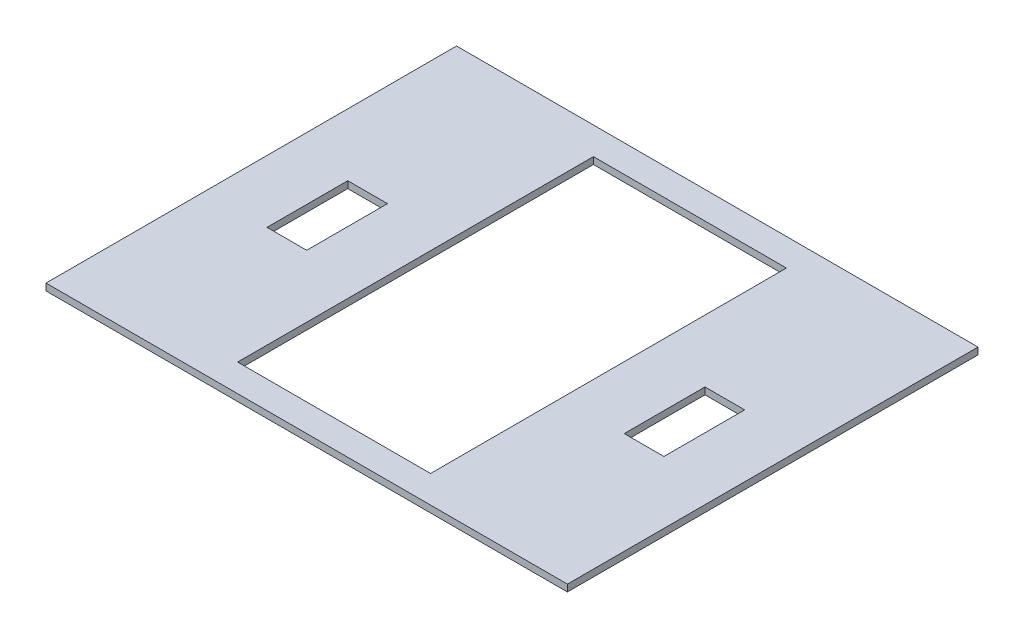
ISO-10303-21;
HEADER;
FILE_DESCRIPTION(('STEP AP214'),'2;1');
FILE_NAME('part.step','',(''),(''),'','','');
FILE_SCHEMA(('AUTOMOTIVE_DESIGN { 1 0 10303 214 1 1 1 1 }'));
ENDSEC;
DATA;
#1=APPLICATION_CONTEXT('core data for automotive mechanical design processes');
#2=APPLICATION_PROTOCOL_DEFINITION('international standard','automotive_design',2000,#1);
#3=PRODUCT_CONTEXT('',#1,'mechanical');
#4=PRODUCT('Part','Part','',(#3));
#5=PRODUCT_RELATED_PRODUCT_CATEGORY('part','',(#4));
#6=PRODUCT_DEFINITION_FORMATION('','',#4);
#7=PRODUCT_DEFINITION_CONTEXT('part definition',#1,'design');
#8=PRODUCT_DEFINITION('design','',#6,#7);
#9=PRODUCT_DEFINITION_SHAPE('','',#8);
#10=(LENGTH_UNIT() NAMED_UNIT(*) SI_UNIT(.MILLI.,.METRE.));
#11=(NAMED_UNIT(*) PLANE_ANGLE_UNIT() SI_UNIT($,.RADIAN.));
#12=(NAMED_UNIT(*) SI_UNIT($,.STERADIAN.) SOLID_ANGLE_UNIT());
#13=UNCERTAINTY_MEASURE_WITH_UNIT(LENGTH_MEASURE(1.E-05),#10,'distance_accuracy_value','');
#14=(GEOMETRIC_REPRESENTATION_CONTEXT(3) GLOBAL_UNCERTAINTY_ASSIGNED_CONTEXT((#13)) GLOBAL_UNIT_ASSIGNED_CONTEXT((#10,
#11,#12)) REPRESENTATION_CONTEXT('',''));
#15=CARTESIAN_POINT('',(0.,0.,0.));
#16=DIRECTION('',(0.,0.,1.));
#17=DIRECTION('',(1.,0.,0.));
#18=AXIS2_PLACEMENT_3D('',#15,#16,#17);
#19=CARTESIAN_POINT('',(0.,5.,0.));
#20=DIRECTION('',(1.,0.,0.));
#21=DIRECTION('',(0.,0.,-1.));
#22=AXIS2_PLACEMENT_3D('',#19,#20,#21);
#23=PLANE('',#22);
#24=DIRECTION('',(0.,0.,1.));
#25=VECTOR('',#24,1.);
#26=CARTESIAN_POINT('',(0.,0.,0.));
#27=LINE('',#26,#25);
#28=CARTESIAN_POINT('',(0.,0.,-300.));
#29=VERTEX_POINT('',#28);
#30=CARTESIAN_POINT('',(0.,0.,0.));
#31=VERTEX_POINT('',#30);
#32=EDGE_CURVE('E199',#29,#31,#27,.T.);
#33=ORIENTED_EDGE('',*,*,#32,.T.);
#34=DIRECTION('',(0.,-1.,0.));
#35=VECTOR('',#34,1.);
#36=CARTESIAN_POINT('',(0.,5.,0.));
#37=LINE('',#36,#35);
#38=CARTESIAN_POINT('',(0.,5.,0.));
#39=VERTEX_POINT('',#38);
#40=EDGE_CURVE('E11',#39,#31,#37,.T.);
#41=ORIENTED_EDGE('',*,*,#40,.F.);
#42=DIRECTION('',(0.,0.,1.));
#43=VECTOR('',#42,1.);
#44=CARTESIAN_POINT('',(0.,5.,0.));
#45=LINE('',#44,#43);
#46=CARTESIAN_POINT('',(0.,5.,-300.));
#47=VERTEX_POINT('',#46);
#48=EDGE_CURVE('E290',#47,#39,#45,.T.);
#49=ORIENTED_EDGE('',*,*,#48,.F.);
#50=DIRECTION('',(0.,-1.,0.));
#51=VECTOR('',#50,1.);
#52=CARTESIAN_POINT('',(0.,5.,-300.));
#53=LINE('',#52,#51);
#54=EDGE_CURVE('E304',#47,#29,#53,.T.);
#55=ORIENTED_EDGE('',*,*,#54,.T.);
#56=EDGE_LOOP('',(#33,#41,#49,#55));
#57=FACE_BOUND('',#56,.T.);
#58=ADVANCED_FACE('F39',(#57),#23,.F.);
#59=CARTESIAN_POINT('',(0.,5.,0.));
#60=DIRECTION('',(0.,0.,-1.));
#61=DIRECTION('',(-1.,0.,0.));
#62=AXIS2_PLACEMENT_3D('',#59,#60,#61);
#63=PLANE('',#62);
#64=DIRECTION('',(1.,0.,0.));
#65=VECTOR('',#64,1.);
#66=CARTESIAN_POINT('',(0.,0.,0.));
#67=LINE('',#66,#65);
#68=CARTESIAN_POINT('',(381.,0.,0.));
#69=VERTEX_POINT('',#68);
#70=EDGE_CURVE('E308',#31,#69,#67,.T.);
#71=ORIENTED_EDGE('',*,*,#70,.T.);
#72=DIRECTION('',(0.,-1.,0.));
#73=VECTOR('',#72,1.);
#74=CARTESIAN_POINT('',(381.,5.,0.));
#75=LINE('',#74,#73);
#76=CARTESIAN_POINT('',(381.,5.,0.));
#77=VERTEX_POINT('',#76);
#78=EDGE_CURVE('E47',#77,#69,#75,.T.);
#79=ORIENTED_EDGE('',*,*,#78,.F.);
#80=DIRECTION('',(1.,0.,0.));
#81=VECTOR('',#80,1.);
#82=CARTESIAN_POINT('',(0.,5.,0.));
#83=LINE('',#82,#81);
#84=EDGE_CURVE('E294',#39,#77,#83,.T.);
#85=ORIENTED_EDGE('',*,*,#84,.F.);
#86=ORIENTED_EDGE('',*,*,#40,.T.);
#87=EDGE_LOOP('',(#71,#79,#85,#86));
#88=FACE_BOUND('',#87,.T.);
#89=ADVANCED_FACE('F343',(#88),#63,.F.);
#90=CARTESIAN_POINT('',(381.,5.,0.));
#91=DIRECTION('',(-1.,0.,0.));
#92=DIRECTION('',(0.,0.,1.));
#93=AXIS2_PLACEMENT_3D('',#90,#91,#92);
#94=PLANE('',#93);
#95=DIRECTION('',(0.,0.,-1.));
#96=VECTOR('',#95,1.);
#97=CARTESIAN_POINT('',(381.,0.,0.));
#98=LINE('',#97,#96);
#99=CARTESIAN_POINT('',(381.,0.,-300.));
#100=VERTEX_POINT('',#99);
#101=EDGE_CURVE('E311',#69,#100,#98,.T.);
#102=ORIENTED_EDGE('',*,*,#101,.T.);
#103=DIRECTION('',(0.,-1.,0.));
#104=VECTOR('',#103,1.);
#105=CARTESIAN_POINT('',(381.,5.,-300.));
#106=LINE('',#105,#104);
#107=CARTESIAN_POINT('',(381.,5.,-300.));
#108=VERTEX_POINT('',#107);
#109=EDGE_CURVE('E319',#108,#100,#106,.T.);
#110=ORIENTED_EDGE('',*,*,#109,.F.);
#111=DIRECTION('',(0.,0.,-1.));
#112=VECTOR('',#111,1.);
#113=CARTESIAN_POINT('',(381.,5.,0.));
#114=LINE('',#113,#112);
#115=EDGE_CURVE('E298',#77,#108,#114,.T.);
#116=ORIENTED_EDGE('',*,*,#115,.F.);
#117=ORIENTED_EDGE('',*,*,#78,.T.);
#118=EDGE_LOOP('',(#102,#110,#116,#117));
#119=FACE_BOUND('',#118,.T.);
#120=ADVANCED_FACE('F328',(#119),#94,.F.);
#121=CARTESIAN_POINT('',(0.,5.,-300.));
#122=DIRECTION('',(0.,0.,1.));
#123=DIRECTION('',(1.,0.,0.));
#124=AXIS2_PLACEMENT_3D('',#121,#122,#123);
#125=PLANE('',#124);
#126=DIRECTION('',(-1.,0.,0.));
#127=VECTOR('',#126,1.);
#128=CARTESIAN_POINT('',(0.,0.,-300.));
#129=LINE('',#128,#127);
#130=EDGE_CURVE('E295',#100,#29,#129,.T.);
#131=ORIENTED_EDGE('',*,*,#130,.T.);
#132=ORIENTED_EDGE('',*,*,#54,.F.);
#133=DIRECTION('',(-1.,0.,0.));
#134=VECTOR('',#133,1.);
#135=CARTESIAN_POINT('',(0.,5.,-300.));
#136=LINE('',#135,#134);
#137=EDGE_CURVE('E301',#108,#47,#136,.T.);
#138=ORIENTED_EDGE('',*,*,#137,.F.);
#139=ORIENTED_EDGE('',*,*,#109,.T.);
#140=EDGE_LOOP('',(#131,#132,#138,#139));
#141=FACE_BOUND('',#140,.T.);
#142=ADVANCED_FACE('F336',(#141),#125,.F.);
#143=CARTESIAN_POINT('',(0.,5.,0.));
#144=DIRECTION('',(0.,-1.,0.));
#145=DIRECTION('',(0.,0.,-1.));
#146=AXIS2_PLACEMENT_3D('',#143,#144,#145);
#147=PLANE('',#146);
#148=DIRECTION('',(1.,0.,0.));
#149=VECTOR('',#148,1.);
#150=CARTESIAN_POINT('',(45.5,5.,-116.));
#151=LINE('',#150,#149);
#152=CARTESIAN_POINT('',(45.5,5.,-116.));
#153=VERTEX_POINT('',#152);
#154=CARTESIAN_POINT('',(74.5,5.,-116.));
#155=VERTEX_POINT('',#154);
#156=EDGE_CURVE('E189',#153,#155,#151,.T.);
#157=ORIENTED_EDGE('',*,*,#156,.F.);
#158=DIRECTION('',(0.,0.,1.));
#159=VECTOR('',#158,1.);
#160=CARTESIAN_POINT('',(45.5,5.,-175.));
#161=LINE('',#160,#159);
#162=CARTESIAN_POINT('',(45.5,5.,-175.));
#163=VERTEX_POINT('',#162);
#164=EDGE_CURVE('E54',#163,#153,#161,.T.);
#165=ORIENTED_EDGE('',*,*,#164,.F.);
#166=DIRECTION('',(-1.,0.,0.));
#167=VECTOR('',#166,1.);
#168=CARTESIAN_POINT('',(45.5,5.,-175.));
#169=LINE('',#168,#167);
#170=CARTESIAN_POINT('',(74.5,5.,-175.));
#171=VERTEX_POINT('',#170);
#172=EDGE_CURVE('E176',#171,#163,#169,.T.);
#173=ORIENTED_EDGE('',*,*,#172,.F.);
#174=DIRECTION('',(0.,0.,-1.));
#175=VECTOR('',#174,1.);
#176=CARTESIAN_POINT('',(74.5,5.,-175.));
#177=LINE('',#176,#175);
#178=EDGE_CURVE('E180',#155,#171,#177,.T.);
#179=ORIENTED_EDGE('',*,*,#178,.F.);
#180=EDGE_LOOP('',(#157,#165,#173,#179));
#181=FACE_BOUND('',#180,.T.);
#182=DIRECTION('',(1.,0.,0.));
#183=VECTOR('',#182,1.);
#184=CARTESIAN_POINT('',(306.5,5.,-116.));
#185=LINE('',#184,#183);
#186=CARTESIAN_POINT('',(306.5,5.,-116.));
#187=VERTEX_POINT('',#186);
#188=CARTESIAN_POINT('',(335.5,5.,-116.));
#189=VERTEX_POINT('',#188);
#190=EDGE_CURVE('E225',#187,#189,#185,.T.);
#191=ORIENTED_EDGE('',*,*,#190,.F.);
#192=DIRECTION('',(0.,0.,1.));
#193=VECTOR('',#192,1.);
#194=CARTESIAN_POINT('',(306.5,5.,-175.));
#195=LINE('',#194,#193);
#196=CARTESIAN_POINT('',(306.5,5.,-175.));
#197=VERTEX_POINT('',#196);
#198=EDGE_CURVE('E62',#197,#187,#195,.T.);
#199=ORIENTED_EDGE('',*,*,#198,.F.);
#200=DIRECTION('',(-1.,0.,0.));
#201=VECTOR('',#200,1.);
#202=CARTESIAN_POINT('',(306.5,5.,-175.));
#203=LINE('',#202,#201);
#204=CARTESIAN_POINT('',(335.5,5.,-175.));
#205=VERTEX_POINT('',#204);
#206=EDGE_CURVE('E210',#205,#197,#203,.T.);
#207=ORIENTED_EDGE('',*,*,#206,.F.);
#208=DIRECTION('',(0.,0.,-1.));
#209=VECTOR('',#208,1.);
#210=CARTESIAN_POINT('',(335.5,5.,-175.));
#211=LINE('',#210,#209);
#212=EDGE_CURVE('E230',#189,#205,#211,.T.);
#213=ORIENTED_EDGE('',*,*,#212,.F.);
#214=EDGE_LOOP('',(#191,#199,#207,#213));
#215=FACE_BOUND('',#214,.T.);
#216=DIRECTION('',(1.,0.,0.));
#217=VECTOR('',#216,1.);
#218=CARTESIAN_POINT('',(120.,5.,-20.));
#219=LINE('',#218,#217);
#220=CARTESIAN_POINT('',(120.,5.,-20.));
#221=VERTEX_POINT('',#220);
#222=CARTESIAN_POINT('',(261.,5.,-20.));
#223=VERTEX_POINT('',#222);
#224=EDGE_CURVE('E268',#221,#223,#219,.T.);
#225=ORIENTED_EDGE('',*,*,#224,.F.);
#226=DIRECTION('',(0.,0.,1.));
#227=VECTOR('',#226,1.);
#228=CARTESIAN_POINT('',(120.,5.,-280.));
#229=LINE('',#228,#227);
#230=CARTESIAN_POINT('',(120.,5.,-280.));
#231=VERTEX_POINT('',#230);
#232=EDGE_CURVE('E265',#231,#221,#229,.T.);
#233=ORIENTED_EDGE('',*,*,#232,.F.);
#234=DIRECTION('',(-1.,0.,0.));
#235=VECTOR('',#234,1.);
#236=CARTESIAN_POINT('',(120.,5.,-280.));
#237=LINE('',#236,#235);
#238=CARTESIAN_POINT('',(261.,5.,-280.));
#239=VERTEX_POINT('',#238);
#240=EDGE_CURVE('E252',#239,#231,#237,.T.);
#241=ORIENTED_EDGE('',*,*,#240,.F.);
#242=DIRECTION('',(0.,0.,-1.));
#243=VECTOR('',#242,1.);
#244=CARTESIAN_POINT('',(261.,5.,-280.));
#245=LINE('',#244,#243);
#246=EDGE_CURVE('E272',#223,#239,#245,.T.);
#247=ORIENTED_EDGE('',*,*,#246,.F.);
#248=EDGE_LOOP('',(#225,#233,#241,#247));
#249=FACE_BOUND('',#248,.T.);
#250=ORIENTED_EDGE('',*,*,#48,.T.);
#251=ORIENTED_EDGE('',*,*,#84,.T.);
#252=ORIENTED_EDGE('',*,*,#115,.T.);
#253=ORIENTED_EDGE('',*,*,#137,.T.);
#254=EDGE_LOOP('',(#250,#251,#252,#253));
#255=FACE_BOUND('',#254,.T.);
#256=ADVANCED_FACE('F342',(#181,#215,#249,#255),#147,.F.);
#257=CARTESIAN_POINT('',(0.,0.,0.));
#258=DIRECTION('',(0.,-1.,0.));
#259=DIRECTION('',(0.,0.,-1.));
#260=AXIS2_PLACEMENT_3D('',#257,#258,#259);
#261=PLANE('',#260);
#262=DIRECTION('',(0.,0.,1.));
#263=VECTOR('',#262,1.);
#264=CARTESIAN_POINT('',(45.5,0.,-175.));
#265=LINE('',#264,#263);
#266=CARTESIAN_POINT('',(45.5,0.,-175.));
#267=VERTEX_POINT('',#266);
#268=CARTESIAN_POINT('',(45.5,0.,-116.));
#269=VERTEX_POINT('',#268);
#270=EDGE_CURVE('E154',#267,#269,#265,.T.);
#271=ORIENTED_EDGE('',*,*,#270,.T.);
#272=DIRECTION('',(1.,0.,0.));
#273=VECTOR('',#272,1.);
#274=CARTESIAN_POINT('',(45.5,0.,-116.));
#275=LINE('',#274,#273);
#276=CARTESIAN_POINT('',(74.5,0.,-116.));
#277=VERTEX_POINT('',#276);
#278=EDGE_CURVE('E165',#269,#277,#275,.T.);
#279=ORIENTED_EDGE('',*,*,#278,.T.);
#280=DIRECTION('',(0.,0.,-1.));
#281=VECTOR('',#280,1.);
#282=CARTESIAN_POINT('',(74.5,0.,-175.));
#283=LINE('',#282,#281);
#284=CARTESIAN_POINT('',(74.5,0.,-175.));
#285=VERTEX_POINT('',#284);
#286=EDGE_CURVE('E170',#277,#285,#283,.T.);
#287=ORIENTED_EDGE('',*,*,#286,.T.);
#288=DIRECTION('',(-1.,0.,0.));
#289=VECTOR('',#288,1.);
#290=CARTESIAN_POINT('',(45.5,0.,-175.));
#291=LINE('',#290,#289);
#292=EDGE_CURVE('E161',#285,#267,#291,.T.);
#293=ORIENTED_EDGE('',*,*,#292,.T.);
#294=EDGE_LOOP('',(#271,#279,#287,#293));
#295=FACE_BOUND('',#294,.T.);
#296=DIRECTION('',(0.,0.,1.));
#297=VECTOR('',#296,1.);
#298=CARTESIAN_POINT('',(306.5,0.,-175.));
#299=LINE('',#298,#297);
#300=CARTESIAN_POINT('',(306.5,0.,-175.));
#301=VERTEX_POINT('',#300);
#302=CARTESIAN_POINT('',(306.5,0.,-116.));
#303=VERTEX_POINT('',#302);
#304=EDGE_CURVE('E205',#301,#303,#299,.T.);
#305=ORIENTED_EDGE('',*,*,#304,.T.);
#306=DIRECTION('',(1.,0.,0.));
#307=VECTOR('',#306,1.);
#308=CARTESIAN_POINT('',(306.5,0.,-116.));
#309=LINE('',#308,#307);
#310=CARTESIAN_POINT('',(335.5,0.,-116.));
#311=VERTEX_POINT('',#310);
#312=EDGE_CURVE('E209',#303,#311,#309,.T.);
#313=ORIENTED_EDGE('',*,*,#312,.T.);
#314=DIRECTION('',(0.,0.,-1.));
#315=VECTOR('',#314,1.);
#316=CARTESIAN_POINT('',(335.5,0.,-175.));
#317=LINE('',#316,#315);
#318=CARTESIAN_POINT('',(335.5,0.,-175.));
#319=VERTEX_POINT('',#318);
#320=EDGE_CURVE('E214',#311,#319,#317,.T.);
#321=ORIENTED_EDGE('',*,*,#320,.T.);
#322=DIRECTION('',(-1.,0.,0.));
#323=VECTOR('',#322,1.);
#324=CARTESIAN_POINT('',(306.5,0.,-175.));
#325=LINE('',#324,#323);
#326=EDGE_CURVE('E218',#319,#301,#325,.T.);
#327=ORIENTED_EDGE('',*,*,#326,.T.);
#328=EDGE_LOOP('',(#305,#313,#321,#327));
#329=FACE_BOUND('',#328,.T.);
#330=DIRECTION('',(0.,0.,1.));
#331=VECTOR('',#330,1.);
#332=CARTESIAN_POINT('',(120.,0.,-280.));
#333=LINE('',#332,#331);
#334=CARTESIAN_POINT('',(120.,0.,-280.));
#335=VERTEX_POINT('',#334);
#336=CARTESIAN_POINT('',(120.,0.,-20.));
#337=VERTEX_POINT('',#336);
#338=EDGE_CURVE('E247',#335,#337,#333,.T.);
#339=ORIENTED_EDGE('',*,*,#338,.T.);
#340=DIRECTION('',(1.,0.,0.));
#341=VECTOR('',#340,1.);
#342=CARTESIAN_POINT('',(120.,0.,-20.));
#343=LINE('',#342,#341);
#344=CARTESIAN_POINT('',(261.,0.,-20.));
#345=VERTEX_POINT('',#344);
#346=EDGE_CURVE('E251',#337,#345,#343,.T.);
#347=ORIENTED_EDGE('',*,*,#346,.T.);
#348=DIRECTION('',(0.,0.,-1.));
#349=VECTOR('',#348,1.);
#350=CARTESIAN_POINT('',(261.,0.,-280.));
#351=LINE('',#350,#349);
#352=CARTESIAN_POINT('',(261.,0.,-280.));
#353=VERTEX_POINT('',#352);
#354=EDGE_CURVE('E256',#345,#353,#351,.T.);
#355=ORIENTED_EDGE('',*,*,#354,.T.);
#356=DIRECTION('',(-1.,0.,0.));
#357=VECTOR('',#356,1.);
#358=CARTESIAN_POINT('',(120.,0.,-280.));
#359=LINE('',#358,#357);
#360=EDGE_CURVE('E260',#353,#335,#359,.T.);
#361=ORIENTED_EDGE('',*,*,#360,.T.);
#362=EDGE_LOOP('',(#339,#347,#355,#361));
#363=FACE_BOUND('',#362,.T.);
#364=ORIENTED_EDGE('',*,*,#32,.F.);
#365=ORIENTED_EDGE('',*,*,#130,.F.);
#366=ORIENTED_EDGE('',*,*,#101,.F.);
#367=ORIENTED_EDGE('',*,*,#70,.F.);
#368=EDGE_LOOP('',(#364,#365,#366,#367));
#369=FACE_BOUND('',#368,.T.);
#370=ADVANCED_FACE('F172',(#295,#329,#363,#369),#261,.T.);
#371=CARTESIAN_POINT('',(120.,0.,-280.));
#372=DIRECTION('',(-1.,0.,0.));
#373=DIRECTION('',(0.,0.,1.));
#374=AXIS2_PLACEMENT_3D('',#371,#372,#373);
#375=PLANE('',#374);
#376=ORIENTED_EDGE('',*,*,#232,.T.);
#377=DIRECTION('',(0.,1.,0.));
#378=VECTOR('',#377,1.);
#379=CARTESIAN_POINT('',(120.,0.,-20.));
#380=LINE('',#379,#378);
#381=EDGE_CURVE('E264',#337,#221,#380,.T.);
#382=ORIENTED_EDGE('',*,*,#381,.F.);
#383=ORIENTED_EDGE('',*,*,#338,.F.);
#384=DIRECTION('',(0.,1.,0.));
#385=VECTOR('',#384,1.);
#386=CARTESIAN_POINT('',(120.,0.,-280.));
#387=LINE('',#386,#385);
#388=EDGE_CURVE('E226',#335,#231,#387,.T.);
#389=ORIENTED_EDGE('',*,*,#388,.T.);
#390=EDGE_LOOP('',(#376,#382,#383,#389));
#391=FACE_BOUND('',#390,.T.);
#392=ADVANCED_FACE('F355',(#391),#375,.F.);
#393=CARTESIAN_POINT('',(120.,0.,-280.));
#394=DIRECTION('',(0.,0.,-1.));
#395=DIRECTION('',(-1.,0.,0.));
#396=AXIS2_PLACEMENT_3D('',#393,#394,#395);
#397=PLANE('',#396);
#398=ORIENTED_EDGE('',*,*,#240,.T.);
#399=ORIENTED_EDGE('',*,*,#388,.F.);
#400=ORIENTED_EDGE('',*,*,#360,.F.);
#401=DIRECTION('',(0.,1.,0.));
#402=VECTOR('',#401,1.);
#403=CARTESIAN_POINT('',(261.,0.,-280.));
#404=LINE('',#403,#402);
#405=EDGE_CURVE('E281',#353,#239,#404,.T.);
#406=ORIENTED_EDGE('',*,*,#405,.T.);
#407=EDGE_LOOP('',(#398,#399,#400,#406));
#408=FACE_BOUND('',#407,.T.);
#409=ADVANCED_FACE('F361',(#408),#397,.F.);
#410=CARTESIAN_POINT('',(261.,0.,-280.));
#411=DIRECTION('',(1.,0.,0.));
#412=DIRECTION('',(0.,0.,-1.));
#413=AXIS2_PLACEMENT_3D('',#410,#411,#412);
#414=PLANE('',#413);
#415=ORIENTED_EDGE('',*,*,#246,.T.);
#416=ORIENTED_EDGE('',*,*,#405,.F.);
#417=ORIENTED_EDGE('',*,*,#354,.F.);
#418=DIRECTION('',(0.,1.,0.));
#419=VECTOR('',#418,1.);
#420=CARTESIAN_POINT('',(261.,0.,-20.));
#421=LINE('',#420,#419);
#422=EDGE_CURVE('E284',#345,#223,#421,.T.);
#423=ORIENTED_EDGE('',*,*,#422,.T.);
#424=EDGE_LOOP('',(#415,#416,#417,#423));
#425=FACE_BOUND('',#424,.T.);
#426=ADVANCED_FACE('F367',(#425),#414,.F.);
#427=CARTESIAN_POINT('',(120.,0.,-20.));
#428=DIRECTION('',(0.,0.,1.));
#429=DIRECTION('',(1.,0.,0.));
#430=AXIS2_PLACEMENT_3D('',#427,#428,#429);
#431=PLANE('',#430);
#432=ORIENTED_EDGE('',*,*,#224,.T.);
#433=ORIENTED_EDGE('',*,*,#422,.F.);
#434=ORIENTED_EDGE('',*,*,#346,.F.);
#435=ORIENTED_EDGE('',*,*,#381,.T.);
#436=EDGE_LOOP('',(#432,#433,#434,#435));
#437=FACE_BOUND('',#436,.T.);
#438=ADVANCED_FACE('F363',(#437),#431,.F.);
#439=CARTESIAN_POINT('',(306.5,0.,-175.));
#440=DIRECTION('',(-1.,0.,0.));
#441=DIRECTION('',(0.,0.,1.));
#442=AXIS2_PLACEMENT_3D('',#439,#440,#441);
#443=PLANE('',#442);
#444=ORIENTED_EDGE('',*,*,#198,.T.);
#445=DIRECTION('',(0.,1.,0.));
#446=VECTOR('',#445,1.);
#447=CARTESIAN_POINT('',(306.5,0.,-116.));
#448=LINE('',#447,#446);
#449=EDGE_CURVE('E222',#303,#187,#448,.T.);
#450=ORIENTED_EDGE('',*,*,#449,.F.);
#451=ORIENTED_EDGE('',*,*,#304,.F.);
#452=DIRECTION('',(0.,1.,0.));
#453=VECTOR('',#452,1.);
#454=CARTESIAN_POINT('',(306.5,0.,-175.));
#455=LINE('',#454,#453);
#456=EDGE_CURVE('E190',#301,#197,#455,.T.);
#457=ORIENTED_EDGE('',*,*,#456,.T.);
#458=EDGE_LOOP('',(#444,#450,#451,#457));
#459=FACE_BOUND('',#458,.T.);
#460=ADVANCED_FACE('F366',(#459),#443,.F.);
#461=CARTESIAN_POINT('',(306.5,0.,-175.));
#462=DIRECTION('',(0.,0.,-1.));
#463=DIRECTION('',(-1.,0.,0.));
#464=AXIS2_PLACEMENT_3D('',#461,#462,#463);
#465=PLANE('',#464);
#466=ORIENTED_EDGE('',*,*,#206,.T.);
#467=ORIENTED_EDGE('',*,*,#456,.F.);
#468=ORIENTED_EDGE('',*,*,#326,.F.);
#469=DIRECTION('',(0.,1.,0.));
#470=VECTOR('',#469,1.);
#471=CARTESIAN_POINT('',(335.5,0.,-175.));
#472=LINE('',#471,#470);
#473=EDGE_CURVE('E239',#319,#205,#472,.T.);
#474=ORIENTED_EDGE('',*,*,#473,.T.);
#475=EDGE_LOOP('',(#466,#467,#468,#474));
#476=FACE_BOUND('',#475,.T.);
#477=ADVANCED_FACE('F377',(#476),#465,.F.);
#478=CARTESIAN_POINT('',(335.5,0.,-175.));
#479=DIRECTION('',(1.,0.,0.));
#480=DIRECTION('',(0.,0.,-1.));
#481=AXIS2_PLACEMENT_3D('',#478,#479,#480);
#482=PLANE('',#481);
#483=ORIENTED_EDGE('',*,*,#212,.T.);
#484=ORIENTED_EDGE('',*,*,#473,.F.);
#485=ORIENTED_EDGE('',*,*,#320,.F.);
#486=DIRECTION('',(0.,1.,0.));
#487=VECTOR('',#486,1.);
#488=CARTESIAN_POINT('',(335.5,0.,-116.));
#489=LINE('',#488,#487);
#490=EDGE_CURVE('E242',#311,#189,#489,.T.);
#491=ORIENTED_EDGE('',*,*,#490,.T.);
#492=EDGE_LOOP('',(#483,#484,#485,#491));
#493=FACE_BOUND('',#492,.T.);
#494=ADVANCED_FACE('F381',(#493),#482,.F.);
#495=CARTESIAN_POINT('',(306.5,0.,-116.));
#496=DIRECTION('',(0.,0.,1.));
#497=DIRECTION('',(1.,0.,0.));
#498=AXIS2_PLACEMENT_3D('',#495,#496,#497);
#499=PLANE('',#498);
#500=ORIENTED_EDGE('',*,*,#190,.T.);
#501=ORIENTED_EDGE('',*,*,#490,.F.);
#502=ORIENTED_EDGE('',*,*,#312,.F.);
#503=ORIENTED_EDGE('',*,*,#449,.T.);
#504=EDGE_LOOP('',(#500,#501,#502,#503));
#505=FACE_BOUND('',#504,.T.);
#506=ADVANCED_FACE('F378',(#505),#499,.F.);
#507=CARTESIAN_POINT('',(45.5,0.,-175.));
#508=DIRECTION('',(-1.,0.,0.));
#509=DIRECTION('',(0.,0.,1.));
#510=AXIS2_PLACEMENT_3D('',#507,#508,#509);
#511=PLANE('',#510);
#512=ORIENTED_EDGE('',*,*,#164,.T.);
#513=DIRECTION('',(0.,1.,0.));
#514=VECTOR('',#513,1.);
#515=CARTESIAN_POINT('',(45.5,0.,-116.));
#516=LINE('',#515,#514);
#517=EDGE_CURVE('E150',#269,#153,#516,.T.);
#518=ORIENTED_EDGE('',*,*,#517,.F.);
#519=ORIENTED_EDGE('',*,*,#270,.F.);
#520=DIRECTION('',(0.,1.,0.));
#521=VECTOR('',#520,1.);
#522=CARTESIAN_POINT('',(45.5,0.,-175.));
#523=LINE('',#522,#521);
#524=EDGE_CURVE('E196',#267,#163,#523,.T.);
#525=ORIENTED_EDGE('',*,*,#524,.T.);
#526=EDGE_LOOP('',(#512,#518,#519,#525));
#527=FACE_BOUND('',#526,.T.);
#528=ADVANCED_FACE('F152',(#527),#511,.F.);
#529=CARTESIAN_POINT('',(45.5,0.,-175.));
#530=DIRECTION('',(0.,0.,-1.));
#531=DIRECTION('',(-1.,0.,0.));
#532=AXIS2_PLACEMENT_3D('',#529,#530,#531);
#533=PLANE('',#532);
#534=ORIENTED_EDGE('',*,*,#172,.T.);
#535=ORIENTED_EDGE('',*,*,#524,.F.);
#536=ORIENTED_EDGE('',*,*,#292,.F.);
#537=DIRECTION('',(0.,1.,0.));
#538=VECTOR('',#537,1.);
#539=CARTESIAN_POINT('',(74.5,0.,-175.));
#540=LINE('',#539,#538);
#541=EDGE_CURVE('E200',#285,#171,#540,.T.);
#542=ORIENTED_EDGE('',*,*,#541,.T.);
#543=EDGE_LOOP('',(#534,#535,#536,#542));
#544=FACE_BOUND('',#543,.T.);
#545=ADVANCED_FACE('F391',(#544),#533,.F.);
#546=CARTESIAN_POINT('',(74.5,0.,-175.));
#547=DIRECTION('',(1.,0.,0.));
#548=DIRECTION('',(0.,0.,-1.));
#549=AXIS2_PLACEMENT_3D('',#546,#547,#548);
#550=PLANE('',#549);
#551=ORIENTED_EDGE('',*,*,#178,.T.);
#552=ORIENTED_EDGE('',*,*,#541,.F.);
#553=ORIENTED_EDGE('',*,*,#286,.F.);
#554=DIRECTION('',(0.,1.,0.));
#555=VECTOR('',#554,1.);
#556=CARTESIAN_POINT('',(74.5,0.,-116.));
#557=LINE('',#556,#555);
#558=EDGE_CURVE('E160',#277,#155,#557,.T.);
#559=ORIENTED_EDGE('',*,*,#558,.T.);
#560=EDGE_LOOP('',(#551,#552,#553,#559));
#561=FACE_BOUND('',#560,.T.);
#562=ADVANCED_FACE('F394',(#561),#550,.F.);
#563=CARTESIAN_POINT('',(45.5,0.,-116.));
#564=DIRECTION('',(0.,0.,1.));
#565=DIRECTION('',(1.,0.,0.));
#566=AXIS2_PLACEMENT_3D('',#563,#564,#565);
#567=PLANE('',#566);
#568=ORIENTED_EDGE('',*,*,#156,.T.);
#569=ORIENTED_EDGE('',*,*,#558,.F.);
#570=ORIENTED_EDGE('',*,*,#278,.F.);
#571=ORIENTED_EDGE('',*,*,#517,.T.);
#572=EDGE_LOOP('',(#568,#569,#570,#571));
#573=FACE_BOUND('',#572,.T.);
#574=ADVANCED_FACE('F166',(#573),#567,.F.);
#575=CLOSED_SHELL('',(#58,#89,#120,#142,#256,#370,#392,#409,#426,#438,#460,#477,#494,#506,#528,
#545,#562,#574));
#576=MANIFOLD_SOLID_BREP('B2',#575);
#577=ADVANCED_BREP_SHAPE_REPRESENTATION('',(#18,#576),#14);
#578=SHAPE_DEFINITION_REPRESENTATION(#9,#577);
ENDSEC;
END-ISO-10303-21;
